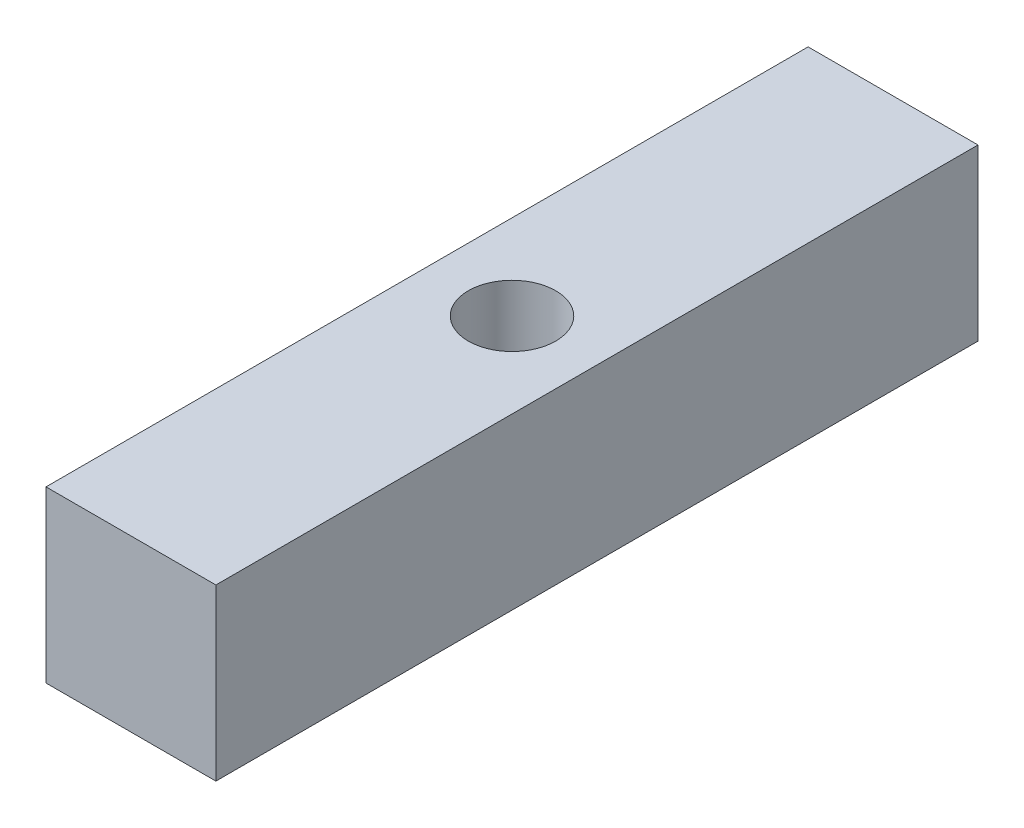
ISO-10303-21;
HEADER;
FILE_DESCRIPTION(('STEP AP214'),'2;1');
FILE_NAME('part.step','',(''),(''),'','','');
FILE_SCHEMA(('AUTOMOTIVE_DESIGN { 1 0 10303 214 1 1 1 1 }'));
ENDSEC;
DATA;
#1=APPLICATION_CONTEXT('core data for automotive mechanical design processes');
#2=APPLICATION_PROTOCOL_DEFINITION('international standard','automotive_design',2000,#1);
#3=PRODUCT_CONTEXT('',#1,'mechanical');
#4=PRODUCT('Part','Part','',(#3));
#5=PRODUCT_RELATED_PRODUCT_CATEGORY('part','',(#4));
#6=PRODUCT_DEFINITION_FORMATION('','',#4);
#7=PRODUCT_DEFINITION_CONTEXT('part definition',#1,'design');
#8=PRODUCT_DEFINITION('design','',#6,#7);
#9=PRODUCT_DEFINITION_SHAPE('','',#8);
#10=(LENGTH_UNIT() NAMED_UNIT(*) SI_UNIT(.MILLI.,.METRE.));
#11=(NAMED_UNIT(*) PLANE_ANGLE_UNIT() SI_UNIT($,.RADIAN.));
#12=(NAMED_UNIT(*) SI_UNIT($,.STERADIAN.) SOLID_ANGLE_UNIT());
#13=UNCERTAINTY_MEASURE_WITH_UNIT(LENGTH_MEASURE(1.E-05),#10,'distance_accuracy_value','');
#14=(GEOMETRIC_REPRESENTATION_CONTEXT(3) GLOBAL_UNCERTAINTY_ASSIGNED_CONTEXT((#13)) GLOBAL_UNIT_ASSIGNED_CONTEXT((#10,
#11,#12)) REPRESENTATION_CONTEXT('',''));
#15=CARTESIAN_POINT('',(0.,0.,0.));
#16=DIRECTION('',(0.,0.,1.));
#17=DIRECTION('',(1.,0.,0.));
#18=AXIS2_PLACEMENT_3D('',#15,#16,#17);
#19=CARTESIAN_POINT('',(0.,8.89,0.));
#20=DIRECTION('',(0.,1.,0.));
#21=DIRECTION('',(0.,0.,1.));
#22=AXIS2_PLACEMENT_3D('',#19,#20,#21);
#23=PLANE('',#22);
#24=DIRECTION('',(0.,0.,1.));
#25=VECTOR('',#24,1.);
#26=CARTESIAN_POINT('',(-4.445,8.89,-19.939));
#27=LINE('',#26,#25);
#28=CARTESIAN_POINT('',(-4.445,8.89,-19.939));
#29=VERTEX_POINT('',#28);
#30=CARTESIAN_POINT('',(-4.445,8.89,19.939));
#31=VERTEX_POINT('',#30);
#32=EDGE_CURVE('E92',#29,#31,#27,.T.);
#33=ORIENTED_EDGE('',*,*,#32,.T.);
#34=DIRECTION('',(1.,0.,0.));
#35=VECTOR('',#34,1.);
#36=CARTESIAN_POINT('',(-4.445,8.89,19.939));
#37=LINE('',#36,#35);
#38=CARTESIAN_POINT('',(4.445,8.89,19.939));
#39=VERTEX_POINT('',#38);
#40=EDGE_CURVE('E87',#31,#39,#37,.T.);
#41=ORIENTED_EDGE('',*,*,#40,.T.);
#42=DIRECTION('',(0.,0.,-1.));
#43=VECTOR('',#42,1.);
#44=CARTESIAN_POINT('',(4.445,8.89,-19.939));
#45=LINE('',#44,#43);
#46=CARTESIAN_POINT('',(4.445,8.89,-19.939));
#47=VERTEX_POINT('',#46);
#48=EDGE_CURVE('E90',#39,#47,#45,.T.);
#49=ORIENTED_EDGE('',*,*,#48,.T.);
#50=DIRECTION('',(-1.,0.,0.));
#51=VECTOR('',#50,1.);
#52=CARTESIAN_POINT('',(-4.445,8.89,-19.939));
#53=LINE('',#52,#51);
#54=EDGE_CURVE('E57',#47,#29,#53,.T.);
#55=ORIENTED_EDGE('',*,*,#54,.T.);
#56=EDGE_LOOP('',(#33,#41,#49,#55));
#57=FACE_BOUND('',#56,.T.);
#58=CARTESIAN_POINT('',(0.,8.89,0.));
#59=DIRECTION('',(0.,1.,0.));
#60=DIRECTION('',(0.,0.,1.));
#61=AXIS2_PLACEMENT_3D('',#58,#59,#60);
#62=CIRCLE('',#61,2.286);
#63=CARTESIAN_POINT('',(0.,8.89,2.286));
#64=VERTEX_POINT('',#63);
#65=EDGE_CURVE('E112',#64,#64,#62,.T.);
#66=ORIENTED_EDGE('',*,*,#65,.F.);
#67=EDGE_LOOP('',(#66));
#68=FACE_BOUND('',#67,.T.);
#69=ADVANCED_FACE('F39',(#57,#68),#23,.T.);
#70=CARTESIAN_POINT('',(0.,0.,0.));
#71=DIRECTION('',(0.,1.,0.));
#72=DIRECTION('',(0.,0.,1.));
#73=AXIS2_PLACEMENT_3D('',#70,#71,#72);
#74=PLANE('',#73);
#75=DIRECTION('',(0.,0.,1.));
#76=VECTOR('',#75,1.);
#77=CARTESIAN_POINT('',(-4.445,0.,-19.939));
#78=LINE('',#77,#76);
#79=CARTESIAN_POINT('',(-4.445,0.,-19.939));
#80=VERTEX_POINT('',#79);
#81=CARTESIAN_POINT('',(-4.445,0.,19.939));
#82=VERTEX_POINT('',#81);
#83=EDGE_CURVE('E108',#80,#82,#78,.T.);
#84=ORIENTED_EDGE('',*,*,#83,.F.);
#85=DIRECTION('',(-1.,0.,0.));
#86=VECTOR('',#85,1.);
#87=CARTESIAN_POINT('',(-4.445,0.,-19.939));
#88=LINE('',#87,#86);
#89=CARTESIAN_POINT('',(4.445,0.,-19.939));
#90=VERTEX_POINT('',#89);
#91=EDGE_CURVE('E80',#90,#80,#88,.T.);
#92=ORIENTED_EDGE('',*,*,#91,.F.);
#93=DIRECTION('',(0.,0.,-1.));
#94=VECTOR('',#93,1.);
#95=CARTESIAN_POINT('',(4.445,0.,-19.939));
#96=LINE('',#95,#94);
#97=CARTESIAN_POINT('',(4.445,0.,19.939));
#98=VERTEX_POINT('',#97);
#99=EDGE_CURVE('E74',#98,#90,#96,.T.);
#100=ORIENTED_EDGE('',*,*,#99,.F.);
#101=DIRECTION('',(1.,0.,0.));
#102=VECTOR('',#101,1.);
#103=CARTESIAN_POINT('',(-4.445,0.,19.939));
#104=LINE('',#103,#102);
#105=EDGE_CURVE('E97',#82,#98,#104,.T.);
#106=ORIENTED_EDGE('',*,*,#105,.F.);
#107=EDGE_LOOP('',(#84,#92,#100,#106));
#108=FACE_BOUND('',#107,.T.);
#109=CARTESIAN_POINT('',(0.,0.,0.));
#110=DIRECTION('',(0.,1.,0.));
#111=DIRECTION('',(0.,0.,1.));
#112=AXIS2_PLACEMENT_3D('',#109,#110,#111);
#113=CIRCLE('',#112,2.286);
#114=CARTESIAN_POINT('',(0.,0.,2.286));
#115=VERTEX_POINT('',#114);
#116=EDGE_CURVE('E130',#115,#115,#113,.T.);
#117=ORIENTED_EDGE('',*,*,#116,.T.);
#118=EDGE_LOOP('',(#117));
#119=FACE_BOUND('',#118,.T.);
#120=ADVANCED_FACE('F125',(#108,#119),#74,.F.);
#121=CARTESIAN_POINT('',(-4.445,8.89,-19.939));
#122=DIRECTION('',(1.,0.,0.));
#123=DIRECTION('',(0.,0.,-1.));
#124=AXIS2_PLACEMENT_3D('',#121,#122,#123);
#125=PLANE('',#124);
#126=ORIENTED_EDGE('',*,*,#83,.T.);
#127=DIRECTION('',(0.,-1.,0.));
#128=VECTOR('',#127,1.);
#129=CARTESIAN_POINT('',(-4.445,8.89,19.939));
#130=LINE('',#129,#128);
#131=EDGE_CURVE('E11',#31,#82,#130,.T.);
#132=ORIENTED_EDGE('',*,*,#131,.F.);
#133=ORIENTED_EDGE('',*,*,#32,.F.);
#134=DIRECTION('',(0.,-1.,0.));
#135=VECTOR('',#134,1.);
#136=CARTESIAN_POINT('',(-4.445,8.89,-19.939));
#137=LINE('',#136,#135);
#138=EDGE_CURVE('E104',#29,#80,#137,.T.);
#139=ORIENTED_EDGE('',*,*,#138,.T.);
#140=EDGE_LOOP('',(#126,#132,#133,#139));
#141=FACE_BOUND('',#140,.T.);
#142=ADVANCED_FACE('F41',(#141),#125,.F.);
#143=CARTESIAN_POINT('',(-4.445,8.89,19.939));
#144=DIRECTION('',(0.,0.,-1.));
#145=DIRECTION('',(-1.,0.,0.));
#146=AXIS2_PLACEMENT_3D('',#143,#144,#145);
#147=PLANE('',#146);
#148=ORIENTED_EDGE('',*,*,#105,.T.);
#149=DIRECTION('',(0.,-1.,0.));
#150=VECTOR('',#149,1.);
#151=CARTESIAN_POINT('',(4.445,8.89,19.939));
#152=LINE('',#151,#150);
#153=EDGE_CURVE('E49',#39,#98,#152,.T.);
#154=ORIENTED_EDGE('',*,*,#153,.F.);
#155=ORIENTED_EDGE('',*,*,#40,.F.);
#156=ORIENTED_EDGE('',*,*,#131,.T.);
#157=EDGE_LOOP('',(#148,#154,#155,#156));
#158=FACE_BOUND('',#157,.T.);
#159=ADVANCED_FACE('F96',(#158),#147,.F.);
#160=CARTESIAN_POINT('',(4.445,8.89,-19.939));
#161=DIRECTION('',(-1.,0.,0.));
#162=DIRECTION('',(0.,0.,1.));
#163=AXIS2_PLACEMENT_3D('',#160,#161,#162);
#164=PLANE('',#163);
#165=ORIENTED_EDGE('',*,*,#99,.T.);
#166=DIRECTION('',(0.,-1.,0.));
#167=VECTOR('',#166,1.);
#168=CARTESIAN_POINT('',(4.445,8.89,-19.939));
#169=LINE('',#168,#167);
#170=EDGE_CURVE('E99',#47,#90,#169,.T.);
#171=ORIENTED_EDGE('',*,*,#170,.F.);
#172=ORIENTED_EDGE('',*,*,#48,.F.);
#173=ORIENTED_EDGE('',*,*,#153,.T.);
#174=EDGE_LOOP('',(#165,#171,#172,#173));
#175=FACE_BOUND('',#174,.T.);
#176=ADVANCED_FACE('F100',(#175),#164,.F.);
#177=CARTESIAN_POINT('',(-4.445,8.89,-19.939));
#178=DIRECTION('',(0.,0.,1.));
#179=DIRECTION('',(1.,0.,0.));
#180=AXIS2_PLACEMENT_3D('',#177,#178,#179);
#181=PLANE('',#180);
#182=ORIENTED_EDGE('',*,*,#91,.T.);
#183=ORIENTED_EDGE('',*,*,#138,.F.);
#184=ORIENTED_EDGE('',*,*,#54,.F.);
#185=ORIENTED_EDGE('',*,*,#170,.T.);
#186=EDGE_LOOP('',(#182,#183,#184,#185));
#187=FACE_BOUND('',#186,.T.);
#188=ADVANCED_FACE('F122',(#187),#181,.F.);
#189=CARTESIAN_POINT('',(0.,8.89,0.));
#190=DIRECTION('',(0.,-1.,0.));
#191=DIRECTION('',(0.,0.,-1.));
#192=AXIS2_PLACEMENT_3D('',#189,#190,#191);
#193=CYLINDRICAL_SURFACE('',#192,2.286);
#194=ORIENTED_EDGE('',*,*,#65,.T.);
#195=EDGE_LOOP('',(#194));
#196=FACE_BOUND('',#195,.T.);
#197=ORIENTED_EDGE('',*,*,#116,.F.);
#198=EDGE_LOOP('',(#197));
#199=FACE_BOUND('',#198,.T.);
#200=ADVANCED_FACE('F138',(#196,#199),#193,.F.);
#201=CLOSED_SHELL('',(#69,#120,#142,#159,#176,#188,#200));
#202=MANIFOLD_SOLID_BREP('B2',#201);
#203=ADVANCED_BREP_SHAPE_REPRESENTATION('',(#18,#202),#14);
#204=SHAPE_DEFINITION_REPRESENTATION(#9,#203);
ENDSEC;
END-ISO-10303-21;
